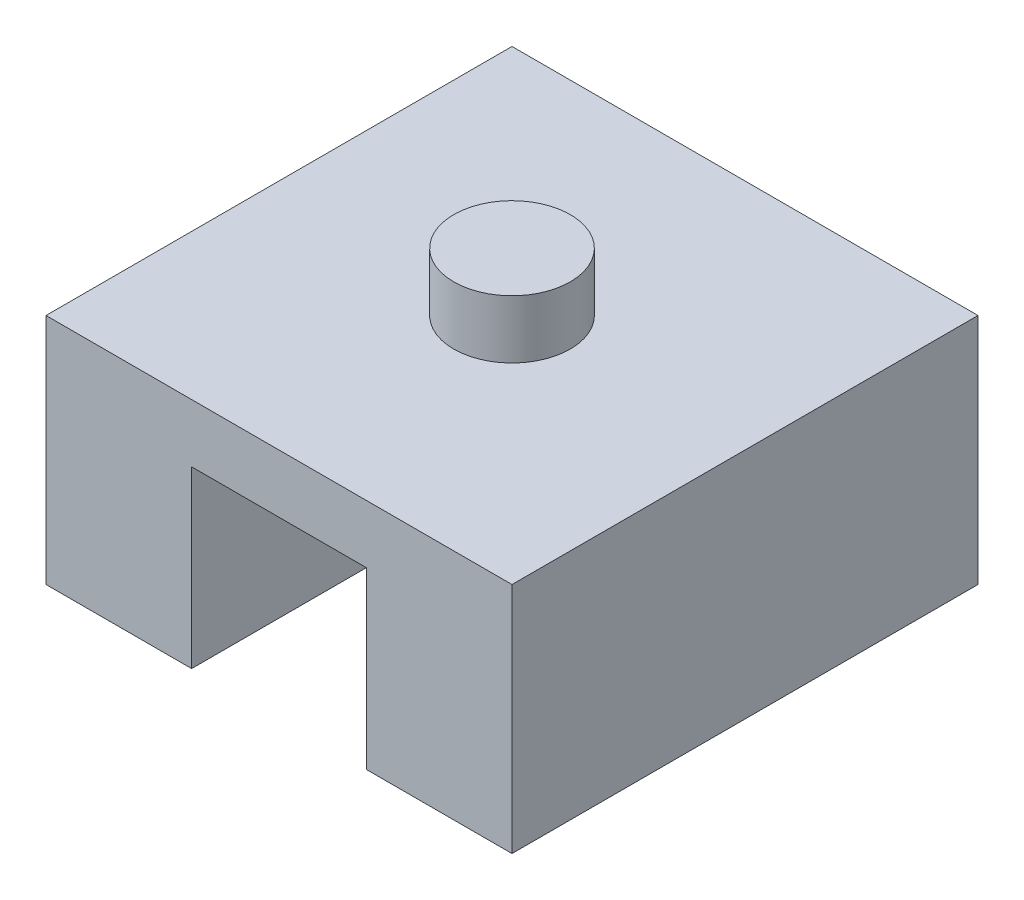
ISO-10303-21;
HEADER;
FILE_DESCRIPTION(('STEP AP214'),'2;1');
FILE_NAME('part.step','',(''),(''),'','','');
FILE_SCHEMA(('AUTOMOTIVE_DESIGN { 1 0 10303 214 1 1 1 1 }'));
ENDSEC;
DATA;
#1=APPLICATION_CONTEXT('core data for automotive mechanical design processes');
#2=APPLICATION_PROTOCOL_DEFINITION('international standard','automotive_design',2000,#1);
#3=PRODUCT_CONTEXT('',#1,'mechanical');
#4=PRODUCT('Part','Part','',(#3));
#5=PRODUCT_RELATED_PRODUCT_CATEGORY('part','',(#4));
#6=PRODUCT_DEFINITION_FORMATION('','',#4);
#7=PRODUCT_DEFINITION_CONTEXT('part definition',#1,'design');
#8=PRODUCT_DEFINITION('design','',#6,#7);
#9=PRODUCT_DEFINITION_SHAPE('','',#8);
#10=(LENGTH_UNIT() NAMED_UNIT(*) SI_UNIT(.MILLI.,.METRE.));
#11=(NAMED_UNIT(*) PLANE_ANGLE_UNIT() SI_UNIT($,.RADIAN.));
#12=(NAMED_UNIT(*) SI_UNIT($,.STERADIAN.) SOLID_ANGLE_UNIT());
#13=UNCERTAINTY_MEASURE_WITH_UNIT(LENGTH_MEASURE(1.E-05),#10,'distance_accuracy_value','');
#14=(GEOMETRIC_REPRESENTATION_CONTEXT(3) GLOBAL_UNCERTAINTY_ASSIGNED_CONTEXT((#13)) GLOBAL_UNIT_ASSIGNED_CONTEXT((#10,
#11,#12)) REPRESENTATION_CONTEXT('',''));
#15=CARTESIAN_POINT('',(0.,0.,0.));
#16=DIRECTION('',(0.,0.,1.));
#17=DIRECTION('',(1.,0.,0.));
#18=AXIS2_PLACEMENT_3D('',#15,#16,#17);
#19=CARTESIAN_POINT('',(0.,0.,50.8));
#20=DIRECTION('',(0.,1.,0.));
#21=DIRECTION('',(0.,0.,1.));
#22=AXIS2_PLACEMENT_3D('',#19,#20,#21);
#23=PLANE('',#22);
#24=DIRECTION('',(1.,0.,0.));
#25=VECTOR('',#24,1.);
#26=CARTESIAN_POINT('',(0.,0.,0.));
#27=LINE('',#26,#25);
#28=CARTESIAN_POINT('',(0.,0.,0.));
#29=VERTEX_POINT('',#28);
#30=CARTESIAN_POINT('',(15.875,0.,0.));
#31=VERTEX_POINT('',#30);
#32=EDGE_CURVE('E133',#29,#31,#27,.T.);
#33=ORIENTED_EDGE('',*,*,#32,.T.);
#34=DIRECTION('',(0.,0.,1.));
#35=VECTOR('',#34,1.);
#36=CARTESIAN_POINT('',(15.875,0.,0.));
#37=LINE('',#36,#35);
#38=CARTESIAN_POINT('',(15.875,0.,50.8));
#39=VERTEX_POINT('',#38);
#40=EDGE_CURVE('E120',#31,#39,#37,.T.);
#41=ORIENTED_EDGE('',*,*,#40,.T.);
#42=DIRECTION('',(1.,0.,0.));
#43=VECTOR('',#42,1.);
#44=CARTESIAN_POINT('',(0.,0.,50.8));
#45=LINE('',#44,#43);
#46=CARTESIAN_POINT('',(0.,0.,50.8));
#47=VERTEX_POINT('',#46);
#48=EDGE_CURVE('E98',#47,#39,#45,.T.);
#49=ORIENTED_EDGE('',*,*,#48,.F.);
#50=DIRECTION('',(0.,0.,-1.));
#51=VECTOR('',#50,1.);
#52=CARTESIAN_POINT('',(0.,0.,50.8));
#53=LINE('',#52,#51);
#54=EDGE_CURVE('E47',#47,#29,#53,.T.);
#55=ORIENTED_EDGE('',*,*,#54,.T.);
#56=EDGE_LOOP('',(#33,#41,#49,#55));
#57=FACE_BOUND('',#56,.T.);
#58=ADVANCED_FACE('F43',(#57),#23,.F.);
#59=CARTESIAN_POINT('',(0.,0.,50.8));
#60=DIRECTION('',(1.,0.,0.));
#61=DIRECTION('',(0.,0.,-1.));
#62=AXIS2_PLACEMENT_3D('',#59,#60,#61);
#63=PLANE('',#62);
#64=DIRECTION('',(0.,-1.,0.));
#65=VECTOR('',#64,1.);
#66=CARTESIAN_POINT('',(0.,0.,0.));
#67=LINE('',#66,#65);
#68=CARTESIAN_POINT('',(0.,25.4,0.));
#69=VERTEX_POINT('',#68);
#70=EDGE_CURVE('E148',#69,#29,#67,.T.);
#71=ORIENTED_EDGE('',*,*,#70,.T.);
#72=ORIENTED_EDGE('',*,*,#54,.F.);
#73=DIRECTION('',(0.,-1.,0.));
#74=VECTOR('',#73,1.);
#75=CARTESIAN_POINT('',(0.,0.,50.8));
#76=LINE('',#75,#74);
#77=CARTESIAN_POINT('',(0.,25.4,50.8));
#78=VERTEX_POINT('',#77);
#79=EDGE_CURVE('E154',#78,#47,#76,.T.);
#80=ORIENTED_EDGE('',*,*,#79,.F.);
#81=DIRECTION('',(0.,0.,-1.));
#82=VECTOR('',#81,1.);
#83=CARTESIAN_POINT('',(0.,25.4,50.8));
#84=LINE('',#83,#82);
#85=EDGE_CURVE('E155',#78,#69,#84,.T.);
#86=ORIENTED_EDGE('',*,*,#85,.T.);
#87=EDGE_LOOP('',(#71,#72,#80,#86));
#88=FACE_BOUND('',#87,.T.);
#89=ADVANCED_FACE('F45',(#88),#63,.F.);
#90=CARTESIAN_POINT('',(34.925,0.,50.8));
#91=VERTEX_POINT('',#90);
#92=CARTESIAN_POINT('',(50.8,0.,50.8));
#93=VERTEX_POINT('',#92);
#94=EDGE_CURVE('E190',#91,#93,#45,.T.);
#95=ORIENTED_EDGE('',*,*,#94,.F.);
#96=DIRECTION('',(0.,0.,1.));
#97=VECTOR('',#96,1.);
#98=CARTESIAN_POINT('',(34.925,0.,0.));
#99=LINE('',#98,#97);
#100=CARTESIAN_POINT('',(34.925,0.,0.));
#101=VERTEX_POINT('',#100);
#102=EDGE_CURVE('E128',#101,#91,#99,.T.);
#103=ORIENTED_EDGE('',*,*,#102,.F.);
#104=CARTESIAN_POINT('',(50.8,0.,0.));
#105=VERTEX_POINT('',#104);
#106=EDGE_CURVE('E143',#101,#105,#27,.T.);
#107=ORIENTED_EDGE('',*,*,#106,.T.);
#108=DIRECTION('',(0.,0.,-1.));
#109=VECTOR('',#108,1.);
#110=CARTESIAN_POINT('',(50.8,0.,50.8));
#111=LINE('',#110,#109);
#112=EDGE_CURVE('E160',#93,#105,#111,.T.);
#113=ORIENTED_EDGE('',*,*,#112,.F.);
#114=EDGE_LOOP('',(#95,#103,#107,#113));
#115=FACE_BOUND('',#114,.T.);
#116=ADVANCED_FACE('F202',(#115),#23,.F.);
#117=CARTESIAN_POINT('',(50.8,0.,50.8));
#118=DIRECTION('',(-1.,0.,0.));
#119=DIRECTION('',(0.,0.,1.));
#120=AXIS2_PLACEMENT_3D('',#117,#118,#119);
#121=PLANE('',#120);
#122=DIRECTION('',(0.,1.,0.));
#123=VECTOR('',#122,1.);
#124=CARTESIAN_POINT('',(50.8,0.,0.));
#125=LINE('',#124,#123);
#126=CARTESIAN_POINT('',(50.8,25.4,0.));
#127=VERTEX_POINT('',#126);
#128=EDGE_CURVE('E142',#105,#127,#125,.T.);
#129=ORIENTED_EDGE('',*,*,#128,.T.);
#130=DIRECTION('',(0.,0.,-1.));
#131=VECTOR('',#130,1.);
#132=CARTESIAN_POINT('',(50.8,25.4,50.8));
#133=LINE('',#132,#131);
#134=CARTESIAN_POINT('',(50.8,25.4,50.8));
#135=VERTEX_POINT('',#134);
#136=EDGE_CURVE('E158',#135,#127,#133,.T.);
#137=ORIENTED_EDGE('',*,*,#136,.F.);
#138=DIRECTION('',(0.,1.,0.));
#139=VECTOR('',#138,1.);
#140=CARTESIAN_POINT('',(50.8,0.,50.8));
#141=LINE('',#140,#139);
#142=EDGE_CURVE('E170',#93,#135,#141,.T.);
#143=ORIENTED_EDGE('',*,*,#142,.F.);
#144=ORIENTED_EDGE('',*,*,#112,.T.);
#145=EDGE_LOOP('',(#129,#137,#143,#144));
#146=FACE_BOUND('',#145,.T.);
#147=ADVANCED_FACE('F168',(#146),#121,.F.);
#148=CARTESIAN_POINT('',(0.,25.4,50.8));
#149=DIRECTION('',(0.,-1.,0.));
#150=DIRECTION('',(0.,0.,-1.));
#151=AXIS2_PLACEMENT_3D('',#148,#149,#150);
#152=PLANE('',#151);
#153=CARTESIAN_POINT('',(25.4,25.4,25.4));
#154=DIRECTION('',(0.,1.,0.));
#155=DIRECTION('',(0.,0.,1.));
#156=AXIS2_PLACEMENT_3D('',#153,#154,#155);
#157=CIRCLE('',#156,6.35);
#158=CARTESIAN_POINT('',(25.4,25.4,31.75));
#159=VERTEX_POINT('',#158);
#160=EDGE_CURVE('E11',#159,#159,#157,.T.);
#161=ORIENTED_EDGE('',*,*,#160,.F.);
#162=EDGE_LOOP('',(#161));
#163=FACE_BOUND('',#162,.T.);
#164=DIRECTION('',(-1.,0.,0.));
#165=VECTOR('',#164,1.);
#166=CARTESIAN_POINT('',(0.,25.4,0.));
#167=LINE('',#166,#165);
#168=EDGE_CURVE('E90',#127,#69,#167,.T.);
#169=ORIENTED_EDGE('',*,*,#168,.T.);
#170=ORIENTED_EDGE('',*,*,#85,.F.);
#171=DIRECTION('',(-1.,0.,0.));
#172=VECTOR('',#171,1.);
#173=CARTESIAN_POINT('',(0.,25.4,50.8));
#174=LINE('',#173,#172);
#175=EDGE_CURVE('E69',#135,#78,#174,.T.);
#176=ORIENTED_EDGE('',*,*,#175,.F.);
#177=ORIENTED_EDGE('',*,*,#136,.T.);
#178=EDGE_LOOP('',(#169,#170,#176,#177));
#179=FACE_BOUND('',#178,.T.);
#180=ADVANCED_FACE('F226',(#163,#179),#152,.F.);
#181=CARTESIAN_POINT('',(0.,0.,50.8));
#182=DIRECTION('',(0.,0.,-1.));
#183=DIRECTION('',(-1.,0.,0.));
#184=AXIS2_PLACEMENT_3D('',#181,#182,#183);
#185=PLANE('',#184);
#186=ORIENTED_EDGE('',*,*,#48,.T.);
#187=DIRECTION('',(0.,-1.,0.));
#188=VECTOR('',#187,1.);
#189=CARTESIAN_POINT('',(15.875,0.,50.8));
#190=LINE('',#189,#188);
#191=CARTESIAN_POINT('',(15.875,19.05,50.8));
#192=VERTEX_POINT('',#191);
#193=EDGE_CURVE('E125',#192,#39,#190,.T.);
#194=ORIENTED_EDGE('',*,*,#193,.F.);
#195=DIRECTION('',(-1.,0.,0.));
#196=VECTOR('',#195,1.);
#197=CARTESIAN_POINT('',(15.875,19.05,50.8));
#198=LINE('',#197,#196);
#199=CARTESIAN_POINT('',(34.925,19.05,50.8));
#200=VERTEX_POINT('',#199);
#201=EDGE_CURVE('E137',#200,#192,#198,.T.);
#202=ORIENTED_EDGE('',*,*,#201,.F.);
#203=DIRECTION('',(0.,1.,0.));
#204=VECTOR('',#203,1.);
#205=CARTESIAN_POINT('',(34.925,0.,50.8));
#206=LINE('',#205,#204);
#207=EDGE_CURVE('E200',#91,#200,#206,.T.);
#208=ORIENTED_EDGE('',*,*,#207,.F.);
#209=ORIENTED_EDGE('',*,*,#94,.T.);
#210=ORIENTED_EDGE('',*,*,#142,.T.);
#211=ORIENTED_EDGE('',*,*,#175,.T.);
#212=ORIENTED_EDGE('',*,*,#79,.T.);
#213=EDGE_LOOP('',(#186,#194,#202,#208,#209,#210,#211,#212));
#214=FACE_BOUND('',#213,.T.);
#215=ADVANCED_FACE('F197',(#214),#185,.F.);
#216=CARTESIAN_POINT('',(0.,0.,0.));
#217=DIRECTION('',(0.,0.,-1.));
#218=DIRECTION('',(-1.,0.,0.));
#219=AXIS2_PLACEMENT_3D('',#216,#217,#218);
#220=PLANE('',#219);
#221=DIRECTION('',(0.,-1.,0.));
#222=VECTOR('',#221,1.);
#223=CARTESIAN_POINT('',(15.875,0.,0.));
#224=LINE('',#223,#222);
#225=CARTESIAN_POINT('',(15.875,19.05,0.));
#226=VERTEX_POINT('',#225);
#227=EDGE_CURVE('E123',#226,#31,#224,.T.);
#228=ORIENTED_EDGE('',*,*,#227,.T.);
#229=ORIENTED_EDGE('',*,*,#32,.F.);
#230=ORIENTED_EDGE('',*,*,#70,.F.);
#231=ORIENTED_EDGE('',*,*,#168,.F.);
#232=ORIENTED_EDGE('',*,*,#128,.F.);
#233=ORIENTED_EDGE('',*,*,#106,.F.);
#234=DIRECTION('',(0.,1.,0.));
#235=VECTOR('',#234,1.);
#236=CARTESIAN_POINT('',(34.925,0.,0.));
#237=LINE('',#236,#235);
#238=CARTESIAN_POINT('',(34.925,19.05,0.));
#239=VERTEX_POINT('',#238);
#240=EDGE_CURVE('E136',#101,#239,#237,.T.);
#241=ORIENTED_EDGE('',*,*,#240,.T.);
#242=DIRECTION('',(-1.,0.,0.));
#243=VECTOR('',#242,1.);
#244=CARTESIAN_POINT('',(15.875,19.05,0.));
#245=LINE('',#244,#243);
#246=EDGE_CURVE('E60',#239,#226,#245,.T.);
#247=ORIENTED_EDGE('',*,*,#246,.T.);
#248=EDGE_LOOP('',(#228,#229,#230,#231,#232,#233,#241,#247));
#249=FACE_BOUND('',#248,.T.);
#250=ADVANCED_FACE('F131',(#249),#220,.T.);
#251=CARTESIAN_POINT('',(15.875,0.,0.));
#252=DIRECTION('',(-1.,0.,0.));
#253=DIRECTION('',(0.,-1.,0.));
#254=AXIS2_PLACEMENT_3D('',#251,#252,#253);
#255=PLANE('',#254);
#256=ORIENTED_EDGE('',*,*,#193,.T.);
#257=ORIENTED_EDGE('',*,*,#40,.F.);
#258=ORIENTED_EDGE('',*,*,#227,.F.);
#259=DIRECTION('',(0.,0.,1.));
#260=VECTOR('',#259,1.);
#261=CARTESIAN_POINT('',(15.875,19.05,0.));
#262=LINE('',#261,#260);
#263=EDGE_CURVE('E176',#226,#192,#262,.T.);
#264=ORIENTED_EDGE('',*,*,#263,.T.);
#265=EDGE_LOOP('',(#256,#257,#258,#264));
#266=FACE_BOUND('',#265,.T.);
#267=ADVANCED_FACE('F122',(#266),#255,.F.);
#268=CARTESIAN_POINT('',(15.875,19.05,0.));
#269=DIRECTION('',(0.,1.,0.));
#270=DIRECTION('',(0.,0.,1.));
#271=AXIS2_PLACEMENT_3D('',#268,#269,#270);
#272=PLANE('',#271);
#273=ORIENTED_EDGE('',*,*,#201,.T.);
#274=ORIENTED_EDGE('',*,*,#263,.F.);
#275=ORIENTED_EDGE('',*,*,#246,.F.);
#276=DIRECTION('',(0.,0.,1.));
#277=VECTOR('',#276,1.);
#278=CARTESIAN_POINT('',(34.925,19.05,0.));
#279=LINE('',#278,#277);
#280=EDGE_CURVE('E178',#239,#200,#279,.T.);
#281=ORIENTED_EDGE('',*,*,#280,.T.);
#282=EDGE_LOOP('',(#273,#274,#275,#281));
#283=FACE_BOUND('',#282,.T.);
#284=ADVANCED_FACE('F214',(#283),#272,.F.);
#285=CARTESIAN_POINT('',(34.925,0.,0.));
#286=DIRECTION('',(1.,0.,0.));
#287=DIRECTION('',(0.,0.,-1.));
#288=AXIS2_PLACEMENT_3D('',#285,#286,#287);
#289=PLANE('',#288);
#290=ORIENTED_EDGE('',*,*,#207,.T.);
#291=ORIENTED_EDGE('',*,*,#280,.F.);
#292=ORIENTED_EDGE('',*,*,#240,.F.);
#293=ORIENTED_EDGE('',*,*,#102,.T.);
#294=EDGE_LOOP('',(#290,#291,#292,#293));
#295=FACE_BOUND('',#294,.T.);
#296=ADVANCED_FACE('F204',(#295),#289,.F.);
#297=CARTESIAN_POINT('',(25.4,31.75,25.4));
#298=DIRECTION('',(0.,-1.,0.));
#299=DIRECTION('',(0.,0.,-1.));
#300=AXIS2_PLACEMENT_3D('',#297,#298,#299);
#301=CYLINDRICAL_SURFACE('',#300,6.35);
#302=CARTESIAN_POINT('',(25.4,31.75,25.4));
#303=DIRECTION('',(0.,1.,0.));
#304=DIRECTION('',(0.,0.,1.));
#305=AXIS2_PLACEMENT_3D('',#302,#303,#304);
#306=CIRCLE('',#305,6.35);
#307=CARTESIAN_POINT('',(25.4,31.75,31.75));
#308=VERTEX_POINT('',#307);
#309=EDGE_CURVE('E211',#308,#308,#306,.T.);
#310=ORIENTED_EDGE('',*,*,#309,.F.);
#311=EDGE_LOOP('',(#310));
#312=FACE_BOUND('',#311,.T.);
#313=ORIENTED_EDGE('',*,*,#160,.T.);
#314=EDGE_LOOP('',(#313));
#315=FACE_BOUND('',#314,.T.);
#316=ADVANCED_FACE('F238',(#312,#315),#301,.T.);
#317=CARTESIAN_POINT('',(25.4,31.75,25.4));
#318=DIRECTION('',(0.,1.,0.));
#319=DIRECTION('',(0.,0.,1.));
#320=AXIS2_PLACEMENT_3D('',#317,#318,#319);
#321=PLANE('',#320);
#322=ORIENTED_EDGE('',*,*,#309,.T.);
#323=EDGE_LOOP('',(#322));
#324=FACE_BOUND('',#323,.T.);
#325=ADVANCED_FACE('F243',(#324),#321,.T.);
#326=CLOSED_SHELL('',(#58,#89,#116,#147,#180,#215,#250,#267,#284,#296,#316,#325));
#327=MANIFOLD_SOLID_BREP('B2',#326);
#328=ADVANCED_BREP_SHAPE_REPRESENTATION('',(#18,#327),#14);
#329=SHAPE_DEFINITION_REPRESENTATION(#9,#328);
ENDSEC;
END-ISO-10303-21;
